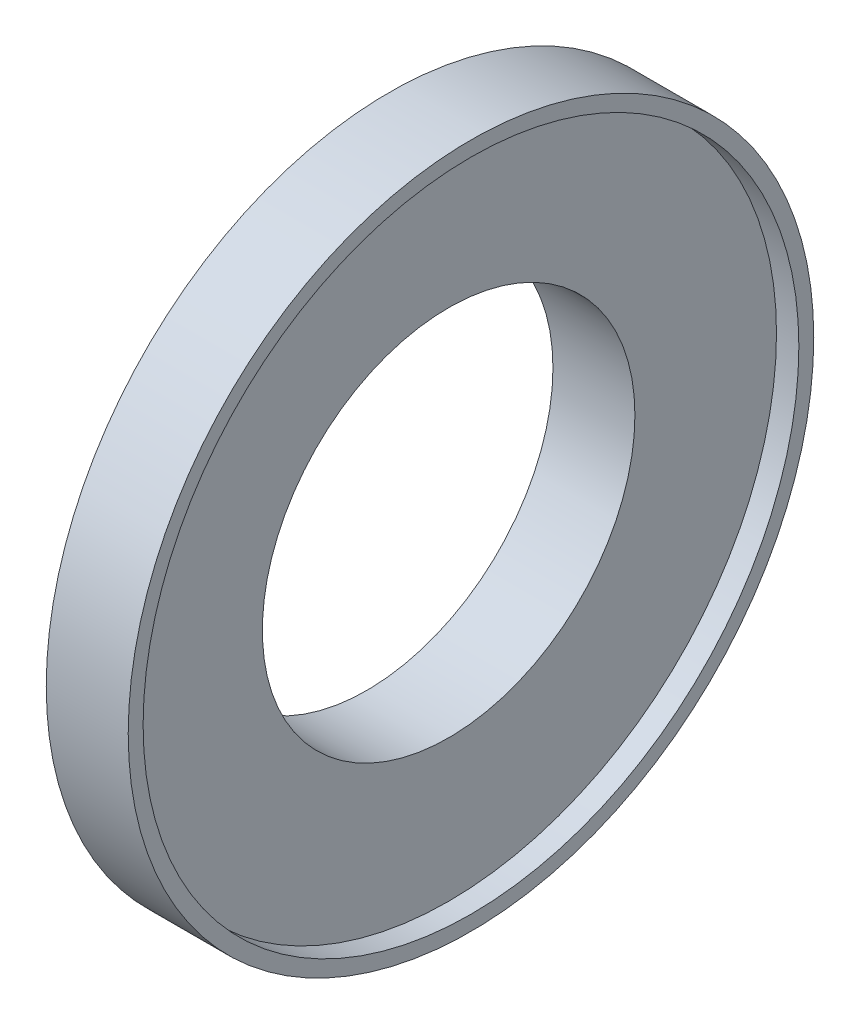
ISO-10303-21;
HEADER;
FILE_DESCRIPTION(('STEP AP214'),'2;1');
FILE_NAME('part.step','',(''),(''),'','','');
FILE_SCHEMA(('AUTOMOTIVE_DESIGN { 1 0 10303 214 1 1 1 1 }'));
ENDSEC;
DATA;
#1=APPLICATION_CONTEXT('core data for automotive mechanical design processes');
#2=APPLICATION_PROTOCOL_DEFINITION('international standard','automotive_design',2000,#1);
#3=PRODUCT_CONTEXT('',#1,'mechanical');
#4=PRODUCT('Part','Part','',(#3));
#5=PRODUCT_RELATED_PRODUCT_CATEGORY('part','',(#4));
#6=PRODUCT_DEFINITION_FORMATION('','',#4);
#7=PRODUCT_DEFINITION_CONTEXT('part definition',#1,'design');
#8=PRODUCT_DEFINITION('design','',#6,#7);
#9=PRODUCT_DEFINITION_SHAPE('','',#8);
#10=(LENGTH_UNIT() NAMED_UNIT(*) SI_UNIT(.MILLI.,.METRE.));
#11=(NAMED_UNIT(*) PLANE_ANGLE_UNIT() SI_UNIT($,.RADIAN.));
#12=(NAMED_UNIT(*) SI_UNIT($,.STERADIAN.) SOLID_ANGLE_UNIT());
#13=UNCERTAINTY_MEASURE_WITH_UNIT(LENGTH_MEASURE(1.E-05),#10,'distance_accuracy_value','');
#14=(GEOMETRIC_REPRESENTATION_CONTEXT(3) GLOBAL_UNCERTAINTY_ASSIGNED_CONTEXT((#13)) GLOBAL_UNIT_ASSIGNED_CONTEXT((#10,
#11,#12)) REPRESENTATION_CONTEXT('',''));
#15=CARTESIAN_POINT('',(0.,0.,0.));
#16=DIRECTION('',(0.,0.,1.));
#17=DIRECTION('',(1.,0.,0.));
#18=AXIS2_PLACEMENT_3D('',#15,#16,#17);
#19=CARTESIAN_POINT('',(0.,0.,0.));
#20=DIRECTION('',(1.,0.,0.));
#21=DIRECTION('',(0.,0.,-1.));
#22=AXIS2_PLACEMENT_3D('',#19,#20,#21);
#23=PLANE('',#22);
#24=CARTESIAN_POINT('',(0.,0.,0.));
#25=DIRECTION('',(1.,0.,0.));
#26=DIRECTION('',(0.,0.,-1.));
#27=AXIS2_PLACEMENT_3D('',#24,#25,#26);
#28=CIRCLE('',#27,4.19100000000001);
#29=CARTESIAN_POINT('',(0.,0.,-4.19100000000001));
#30=VERTEX_POINT('',#29);
#31=EDGE_CURVE('E10',#30,#30,#28,.T.);
#32=ORIENTED_EDGE('',*,*,#31,.T.);
#33=EDGE_LOOP('',(#32));
#34=FACE_BOUND('',#33,.T.);
#35=CARTESIAN_POINT('',(0.,0.,0.));
#36=DIRECTION('',(1.,0.,0.));
#37=DIRECTION('',(0.,0.,-1.));
#38=AXIS2_PLACEMENT_3D('',#35,#36,#37);
#39=CIRCLE('',#38,5.842);
#40=CARTESIAN_POINT('',(0.,0.,-5.842));
#41=VERTEX_POINT('',#40);
#42=EDGE_CURVE('E41',#41,#41,#39,.T.);
#43=ORIENTED_EDGE('',*,*,#42,.F.);
#44=EDGE_LOOP('',(#43));
#45=FACE_BOUND('',#44,.T.);
#46=ADVANCED_FACE('F30',(#34,#45),#23,.F.);
#47=CARTESIAN_POINT('',(1.397,0.,0.));
#48=DIRECTION('',(-1.,0.,0.));
#49=DIRECTION('',(0.,0.,1.));
#50=AXIS2_PLACEMENT_3D('',#47,#48,#49);
#51=CYLINDRICAL_SURFACE('',#50,5.842);
#52=CARTESIAN_POINT('',(1.397,0.,0.));
#53=DIRECTION('',(1.,0.,0.));
#54=DIRECTION('',(0.,0.,-1.));
#55=AXIS2_PLACEMENT_3D('',#52,#53,#54);
#56=CIRCLE('',#55,5.842);
#57=CARTESIAN_POINT('',(1.397,0.,-5.842));
#58=VERTEX_POINT('',#57);
#59=EDGE_CURVE('E37',#58,#58,#56,.T.);
#60=ORIENTED_EDGE('',*,*,#59,.F.);
#61=EDGE_LOOP('',(#60));
#62=FACE_BOUND('',#61,.T.);
#63=ORIENTED_EDGE('',*,*,#42,.T.);
#64=EDGE_LOOP('',(#63));
#65=FACE_BOUND('',#64,.T.);
#66=ADVANCED_FACE('F80',(#62,#65),#51,.T.);
#67=CARTESIAN_POINT('',(1.397,0.,0.));
#68=DIRECTION('',(1.,0.,0.));
#69=DIRECTION('',(0.,0.,-1.));
#70=AXIS2_PLACEMENT_3D('',#67,#68,#69);
#71=PLANE('',#70);
#72=CARTESIAN_POINT('',(1.397,0.,0.));
#73=DIRECTION('',(1.,0.,0.));
#74=DIRECTION('',(0.,0.,-1.));
#75=AXIS2_PLACEMENT_3D('',#72,#73,#74);
#76=CIRCLE('',#75,5.588);
#77=CARTESIAN_POINT('',(1.397,0.,-5.588));
#78=VERTEX_POINT('',#77);
#79=EDGE_CURVE('E48',#78,#78,#76,.T.);
#80=ORIENTED_EDGE('',*,*,#79,.F.);
#81=EDGE_LOOP('',(#80));
#82=FACE_BOUND('',#81,.T.);
#83=ORIENTED_EDGE('',*,*,#59,.T.);
#84=EDGE_LOOP('',(#83));
#85=FACE_BOUND('',#84,.T.);
#86=ADVANCED_FACE('F85',(#82,#85),#71,.T.);
#87=CARTESIAN_POINT('',(1.016,0.,0.));
#88=DIRECTION('',(1.,0.,0.));
#89=DIRECTION('',(0.,0.,-1.));
#90=AXIS2_PLACEMENT_3D('',#87,#88,#89);
#91=CYLINDRICAL_SURFACE('',#90,5.588);
#92=CARTESIAN_POINT('',(1.016,0.,0.));
#93=DIRECTION('',(1.,0.,0.));
#94=DIRECTION('',(0.,0.,-1.));
#95=AXIS2_PLACEMENT_3D('',#92,#93,#94);
#96=CIRCLE('',#95,5.588);
#97=CARTESIAN_POINT('',(1.016,0.,-5.588));
#98=VERTEX_POINT('',#97);
#99=EDGE_CURVE('E46',#98,#98,#96,.T.);
#100=CARTESIAN_POINT('',(1.016,0.,-5.588));
#101=CARTESIAN_POINT('',(1.01996875,0.,-5.588));
#102=CARTESIAN_POINT('',(1.0239375,0.,-5.588));
#103=CARTESIAN_POINT('',(1.031875,0.,-5.588));
#104=CARTESIAN_POINT('',(1.03584375,0.,-5.588));
#105=CARTESIAN_POINT('',(1.04378125,0.,-5.588));
#106=CARTESIAN_POINT('',(1.04775,0.,-5.588));
#107=CARTESIAN_POINT('',(1.0556875,0.,-5.588));
#108=CARTESIAN_POINT('',(1.05965625,0.,-5.588));
#109=CARTESIAN_POINT('',(1.06759375,0.,-5.588));
#110=CARTESIAN_POINT('',(1.0715625,0.,-5.588));
#111=CARTESIAN_POINT('',(1.0795,0.,-5.588));
#112=CARTESIAN_POINT('',(1.08346875,0.,-5.588));
#113=CARTESIAN_POINT('',(1.09140625,0.,-5.588));
#114=CARTESIAN_POINT('',(1.095375,0.,-5.588));
#115=CARTESIAN_POINT('',(1.1033125,0.,-5.588));
#116=CARTESIAN_POINT('',(1.10728125,0.,-5.588));
#117=CARTESIAN_POINT('',(1.11521875,0.,-5.588));
#118=CARTESIAN_POINT('',(1.1191875,0.,-5.588));
#119=CARTESIAN_POINT('',(1.127125,0.,-5.588));
#120=CARTESIAN_POINT('',(1.13109375,0.,-5.588));
#121=CARTESIAN_POINT('',(1.13903125,0.,-5.588));
#122=CARTESIAN_POINT('',(1.143,0.,-5.588));
#123=CARTESIAN_POINT('',(1.1509375,0.,-5.588));
#124=CARTESIAN_POINT('',(1.15490625,0.,-5.588));
#125=CARTESIAN_POINT('',(1.16284375,0.,-5.588));
#126=CARTESIAN_POINT('',(1.1668125,0.,-5.588));
#127=CARTESIAN_POINT('',(1.17475,0.,-5.588));
#128=CARTESIAN_POINT('',(1.17871875,0.,-5.588));
#129=CARTESIAN_POINT('',(1.18665625,0.,-5.588));
#130=CARTESIAN_POINT('',(1.190625,0.,-5.588));
#131=CARTESIAN_POINT('',(1.1985625,0.,-5.588));
#132=CARTESIAN_POINT('',(1.20253125,0.,-5.588));
#133=CARTESIAN_POINT('',(1.21046875,0.,-5.588));
#134=CARTESIAN_POINT('',(1.2144375,0.,-5.588));
#135=CARTESIAN_POINT('',(1.222375,0.,-5.588));
#136=CARTESIAN_POINT('',(1.22634375,0.,-5.588));
#137=CARTESIAN_POINT('',(1.23428125,0.,-5.588));
#138=CARTESIAN_POINT('',(1.23825,0.,-5.588));
#139=CARTESIAN_POINT('',(1.2461875,0.,-5.588));
#140=CARTESIAN_POINT('',(1.25015625,0.,-5.588));
#141=CARTESIAN_POINT('',(1.25809375,0.,-5.588));
#142=CARTESIAN_POINT('',(1.2620625,0.,-5.588));
#143=CARTESIAN_POINT('',(1.27,0.,-5.588));
#144=CARTESIAN_POINT('',(1.27396875,0.,-5.588));
#145=CARTESIAN_POINT('',(1.28190625,0.,-5.588));
#146=CARTESIAN_POINT('',(1.285875,0.,-5.588));
#147=CARTESIAN_POINT('',(1.2938125,0.,-5.588));
#148=CARTESIAN_POINT('',(1.29778125,0.,-5.588));
#149=CARTESIAN_POINT('',(1.30571875,0.,-5.588));
#150=CARTESIAN_POINT('',(1.3096875,0.,-5.588));
#151=CARTESIAN_POINT('',(1.317625,0.,-5.588));
#152=CARTESIAN_POINT('',(1.32159375,0.,-5.588));
#153=CARTESIAN_POINT('',(1.32953125,0.,-5.588));
#154=CARTESIAN_POINT('',(1.3335,0.,-5.588));
#155=CARTESIAN_POINT('',(1.3414375,0.,-5.588));
#156=CARTESIAN_POINT('',(1.34540625,0.,-5.588));
#157=CARTESIAN_POINT('',(1.35334375,0.,-5.588));
#158=CARTESIAN_POINT('',(1.3573125,0.,-5.588));
#159=CARTESIAN_POINT('',(1.36525,0.,-5.588));
#160=CARTESIAN_POINT('',(1.36921875,0.,-5.588));
#161=CARTESIAN_POINT('',(1.37715625,0.,-5.588));
#162=CARTESIAN_POINT('',(1.381125,0.,-5.588));
#163=CARTESIAN_POINT('',(1.3890625,0.,-5.588));
#164=CARTESIAN_POINT('',(1.39303125,0.,-5.588));
#165=CARTESIAN_POINT('',(1.397,0.,-5.588));
#166=B_SPLINE_CURVE_WITH_KNOTS('',3,(#100,#101,#102,#103,#104,#105,#106,#107,#108,#109,#110,
#111,#112,#113,#114,#115,#116,#117,#118,#119,#120,#121,#122,#123,#124,#125,#126,#127,#128,#129,
#130,#131,#132,#133,#134,#135,#136,#137,#138,#139,#140,#141,#142,#143,#144,#145,#146,#147,#148,
#149,#150,#151,#152,#153,#154,#155,#156,#157,#158,#159,#160,#161,#162,#163,#164,#165),
.UNSPECIFIED.,.F.,.F.,(4,2,2,2,2,2,2,2,2,2,2,2,2,2,2,2,2,2,2,2,2,2,2,2,2,2,2,2,2,2,2,2,4),(0.,
0.01190625,0.0238125,0.0357187499999999,0.0476249999999999,0.0595312499999999,
0.0714374999999999,0.0833437499999999,0.0952499999999998,0.10715625,0.1190625,0.13096875,
0.142875,0.15478125,0.1666875,0.17859375,0.1905,0.20240625,0.2143125,0.22621875,0.238125,
0.25003125,0.2619375,0.27384375,0.28575,0.29765625,0.3095625,0.32146875,0.333375,0.34528125,
0.3571875,0.36909375,0.381),.UNSPECIFIED.);
#167=EDGE_CURVE('BSEAM76',#98,#78,#166,.T.);
#168=ORIENTED_EDGE('',*,*,#99,.F.);
#169=ORIENTED_EDGE('',*,*,#79,.T.);
#170=ORIENTED_EDGE('',*,*,#167,.T.);
#171=ORIENTED_EDGE('',*,*,#167,.F.);
#172=EDGE_LOOP('',(#168,#170,#169,#171));
#173=FACE_BOUND('',#172,.T.);
#174=ADVANCED_FACE('F76',(#173),#91,.F.);
#175=CARTESIAN_POINT('',(1.016,0.,0.));
#176=DIRECTION('',(1.,0.,0.));
#177=DIRECTION('',(0.,0.,-1.));
#178=AXIS2_PLACEMENT_3D('',#175,#176,#177);
#179=PLANE('',#178);
#180=CARTESIAN_POINT('',(1.016,0.,0.));
#181=DIRECTION('',(1.,0.,0.));
#182=DIRECTION('',(0.,0.,-1.));
#183=AXIS2_PLACEMENT_3D('',#180,#181,#182);
#184=CIRCLE('',#183,3.175);
#185=CARTESIAN_POINT('',(1.016,0.,-3.175));
#186=VERTEX_POINT('',#185);
#187=EDGE_CURVE('E51',#186,#186,#184,.T.);
#188=ORIENTED_EDGE('',*,*,#187,.F.);
#189=EDGE_LOOP('',(#188));
#190=FACE_BOUND('',#189,.T.);
#191=ORIENTED_EDGE('',*,*,#99,.T.);
#192=EDGE_LOOP('',(#191));
#193=FACE_BOUND('',#192,.T.);
#194=ADVANCED_FACE('F68',(#190,#193),#179,.T.);
#195=CARTESIAN_POINT('',(0.,0.,0.));
#196=DIRECTION('',(1.,0.,0.));
#197=DIRECTION('',(0.,0.,-1.));
#198=AXIS2_PLACEMENT_3D('',#195,#196,#197);
#199=CYLINDRICAL_SURFACE('',#198,3.175);
#200=ORIENTED_EDGE('',*,*,#187,.T.);
#201=EDGE_LOOP('',(#200));
#202=FACE_BOUND('',#201,.T.);
#203=CARTESIAN_POINT('',(-0.381,0.,0.));
#204=DIRECTION('',(1.,0.,0.));
#205=DIRECTION('',(0.,0.,-1.));
#206=AXIS2_PLACEMENT_3D('',#203,#204,#205);
#207=CIRCLE('',#206,3.175);
#208=CARTESIAN_POINT('',(-0.381,0.,-3.175));
#209=VERTEX_POINT('',#208);
#210=EDGE_CURVE('E59',#209,#209,#207,.T.);
#211=ORIENTED_EDGE('',*,*,#210,.F.);
#212=EDGE_LOOP('',(#211));
#213=FACE_BOUND('',#212,.T.);
#214=ADVANCED_FACE('F66',(#202,#213),#199,.F.);
#215=CARTESIAN_POINT('',(-0.381,0.,0.));
#216=DIRECTION('',(-1.,0.,0.));
#217=DIRECTION('',(0.,0.,1.));
#218=AXIS2_PLACEMENT_3D('',#215,#216,#217);
#219=PLANE('',#218);
#220=ORIENTED_EDGE('',*,*,#210,.T.);
#221=EDGE_LOOP('',(#220));
#222=FACE_BOUND('',#221,.T.);
#223=CARTESIAN_POINT('',(-0.381,0.,0.));
#224=DIRECTION('',(-1.,0.,0.));
#225=DIRECTION('',(0.,0.,1.));
#226=AXIS2_PLACEMENT_3D('',#223,#224,#225);
#227=CIRCLE('',#226,3.81);
#228=CARTESIAN_POINT('',(-0.381,0.,-3.81000000000001));
#229=VERTEX_POINT('',#228);
#230=EDGE_CURVE('E56',#229,#229,#227,.T.);
#231=ORIENTED_EDGE('',*,*,#230,.T.);
#232=EDGE_LOOP('',(#231));
#233=FACE_BOUND('',#232,.T.);
#234=ADVANCED_FACE('F63',(#222,#233),#219,.T.);
#235=CARTESIAN_POINT('',(-0.381000000000012,0.,0.));
#236=DIRECTION('',(1.,0.,0.));
#237=DIRECTION('',(0.,0.,-1.));
#238=AXIS2_PLACEMENT_3D('',#235,#236,#237);
#239=CONICAL_SURFACE('',#238,3.81,0.785398163397441);
#240=CARTESIAN_POINT('',(0.,0.,-4.19100000000001));
#241=CARTESIAN_POINT('',(-0.00396875000000004,0.,-4.18703125000001));
#242=CARTESIAN_POINT('',(-0.00793750000000003,0.,-4.18306250000001));
#243=CARTESIAN_POINT('',(-0.015875,0.,-4.17512500000001));
#244=CARTESIAN_POINT('',(-0.0198437500000001,0.,-4.17115625000001));
#245=CARTESIAN_POINT('',(-0.0277812500000001,0.,-4.16321875000001));
#246=CARTESIAN_POINT('',(-0.0317500000000001,0.,-4.15925000000001));
#247=CARTESIAN_POINT('',(-0.0396875,0.,-4.15131250000001));
#248=CARTESIAN_POINT('',(-0.04365625,0.,-4.14734375000001));
#249=CARTESIAN_POINT('',(-0.05159375,0.,-4.13940625000001));
#250=CARTESIAN_POINT('',(-0.0555625000000001,0.,-4.13543750000001));
#251=CARTESIAN_POINT('',(-0.0635000000000001,0.,-4.12750000000001));
#252=CARTESIAN_POINT('',(-0.06746875,0.,-4.12353125000001));
#253=CARTESIAN_POINT('',(-0.0754062500000001,0.,-4.11559375000001));
#254=CARTESIAN_POINT('',(-0.0793750000000001,0.,-4.11162500000001));
#255=CARTESIAN_POINT('',(-0.0873125000000001,0.,-4.10368750000001));
#256=CARTESIAN_POINT('',(-0.09128125,0.,-4.09971875000001));
#257=CARTESIAN_POINT('',(-0.09921875,0.,-4.09178125000001));
#258=CARTESIAN_POINT('',(-0.1031875,0.,-4.08781250000001));
#259=CARTESIAN_POINT('',(-0.111125,0.,-4.07987500000001));
#260=CARTESIAN_POINT('',(-0.11509375,0.,-4.07590625000001));
#261=CARTESIAN_POINT('',(-0.12303125,0.,-4.06796875000001));
#262=CARTESIAN_POINT('',(-0.127,0.,-4.06400000000001));
#263=CARTESIAN_POINT('',(-0.1349375,0.,-4.05606250000001));
#264=CARTESIAN_POINT('',(-0.13890625,0.,-4.05209375000001));
#265=CARTESIAN_POINT('',(-0.14684375,0.,-4.04415625000001));
#266=CARTESIAN_POINT('',(-0.1508125,0.,-4.04018750000001));
#267=CARTESIAN_POINT('',(-0.15875,0.,-4.03225000000001));
#268=CARTESIAN_POINT('',(-0.16271875,0.,-4.02828125000001));
#269=CARTESIAN_POINT('',(-0.17065625,0.,-4.02034375000001));
#270=CARTESIAN_POINT('',(-0.174625,0.,-4.01637500000001));
#271=CARTESIAN_POINT('',(-0.1825625,0.,-4.00843750000001));
#272=CARTESIAN_POINT('',(-0.18653125,0.,-4.00446875000001));
#273=CARTESIAN_POINT('',(-0.19446875,0.,-3.99653125000001));
#274=CARTESIAN_POINT('',(-0.1984375,0.,-3.99256250000001));
#275=CARTESIAN_POINT('',(-0.206375,0.,-3.98462500000001));
#276=CARTESIAN_POINT('',(-0.21034375,0.,-3.98065625000001));
#277=CARTESIAN_POINT('',(-0.21828125,0.,-3.97271875000001));
#278=CARTESIAN_POINT('',(-0.22225,0.,-3.96875000000001));
#279=CARTESIAN_POINT('',(-0.2301875,0.,-3.96081250000001));
#280=CARTESIAN_POINT('',(-0.23415625,0.,-3.95684375000001));
#281=CARTESIAN_POINT('',(-0.24209375,0.,-3.94890625000001));
#282=CARTESIAN_POINT('',(-0.2460625,0.,-3.94493750000001));
#283=CARTESIAN_POINT('',(-0.254,0.,-3.93700000000001));
#284=CARTESIAN_POINT('',(-0.25796875,0.,-3.93303125000001));
#285=CARTESIAN_POINT('',(-0.26590625,0.,-3.92509375000001));
#286=CARTESIAN_POINT('',(-0.269875,0.,-3.92112500000001));
#287=CARTESIAN_POINT('',(-0.2778125,0.,-3.91318750000001));
#288=CARTESIAN_POINT('',(-0.28178125,0.,-3.90921875000001));
#289=CARTESIAN_POINT('',(-0.28971875,0.,-3.90128125000001));
#290=CARTESIAN_POINT('',(-0.2936875,0.,-3.89731250000001));
#291=CARTESIAN_POINT('',(-0.301625,0.,-3.88937500000001));
#292=CARTESIAN_POINT('',(-0.30559375,0.,-3.88540625000001));
#293=CARTESIAN_POINT('',(-0.31353125,0.,-3.87746875000001));
#294=CARTESIAN_POINT('',(-0.3175,0.,-3.87350000000001));
#295=CARTESIAN_POINT('',(-0.3254375,0.,-3.86556250000001));
#296=CARTESIAN_POINT('',(-0.32940625,0.,-3.86159375000001));
#297=CARTESIAN_POINT('',(-0.33734375,0.,-3.85365625000001));
#298=CARTESIAN_POINT('',(-0.3413125,0.,-3.84968750000001));
#299=CARTESIAN_POINT('',(-0.34925,0.,-3.84175000000001));
#300=CARTESIAN_POINT('',(-0.35321875,0.,-3.83778125000001));
#301=CARTESIAN_POINT('',(-0.36115625,0.,-3.82984375000001));
#302=CARTESIAN_POINT('',(-0.365125,0.,-3.82587500000001));
#303=CARTESIAN_POINT('',(-0.3730625,0.,-3.81793750000001));
#304=CARTESIAN_POINT('',(-0.37703125,0.,-3.81396875000001));
#305=CARTESIAN_POINT('',(-0.381,0.,-3.81000000000001));
#306=B_SPLINE_CURVE_WITH_KNOTS('',3,(#240,#241,#242,#243,#244,#245,#246,#247,#248,#249,#250,
#251,#252,#253,#254,#255,#256,#257,#258,#259,#260,#261,#262,#263,#264,#265,#266,#267,#268,#269,
#270,#271,#272,#273,#274,#275,#276,#277,#278,#279,#280,#281,#282,#283,#284,#285,#286,#287,#288,
#289,#290,#291,#292,#293,#294,#295,#296,#297,#298,#299,#300,#301,#302,#303,#304,#305),
.UNSPECIFIED.,.F.,.F.,(4,2,2,2,2,2,2,2,2,2,2,2,2,2,2,2,2,2,2,2,2,2,2,2,2,2,2,2,2,2,2,2,4),(0.,
0.0168379802270045,0.033675960454009,0.0505139406810135,0.067351920908018,0.0841899011350225,
0.101027881362027,0.117865861589031,0.134703841816037,0.151541822043041,0.168379802270046,
0.18521778249705,0.202055762724054,0.218893742951059,0.235731723178064,0.252569703405068,
0.269407683632073,0.286245663859077,0.303083644086082,0.319921624313086,0.336759604540091,
0.353597584767095,0.3704355649941,0.387273545221105,0.404111525448109,0.420949505675113,
0.437787485902118,0.454625466129123,0.471463446356127,0.488301426583132,0.505139406810136,
0.521977387037141,0.538815367264145),.UNSPECIFIED.);
#307=EDGE_CURVE('BSEAM32',#30,#229,#306,.T.);
#308=ORIENTED_EDGE('',*,*,#31,.F.);
#309=ORIENTED_EDGE('',*,*,#230,.F.);
#310=ORIENTED_EDGE('',*,*,#307,.T.);
#311=ORIENTED_EDGE('',*,*,#307,.F.);
#312=EDGE_LOOP('',(#308,#310,#309,#311));
#313=FACE_BOUND('',#312,.T.);
#314=ADVANCED_FACE('F32',(#313),#239,.T.);
#315=CLOSED_SHELL('',(#46,#66,#86,#174,#194,#214,#234,#314));
#316=MANIFOLD_SOLID_BREP('B2',#315);
#317=ADVANCED_BREP_SHAPE_REPRESENTATION('',(#18,#316),#14);
#318=SHAPE_DEFINITION_REPRESENTATION(#9,#317);
ENDSEC;
END-ISO-10303-21;
